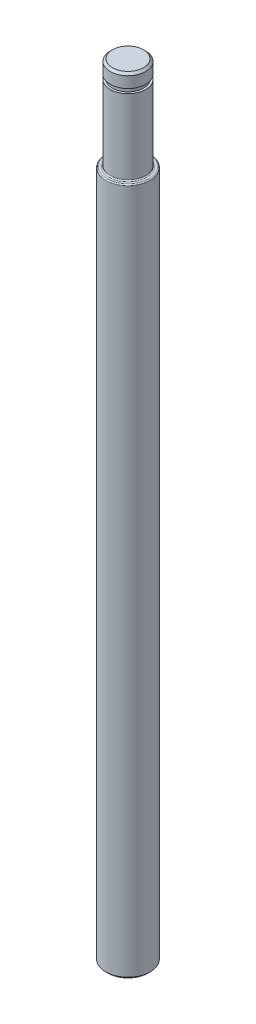
ISO-10303-21;
HEADER;
FILE_DESCRIPTION(('STEP AP214'),'2;1');
FILE_NAME('part.step','',(''),(''),'','','');
FILE_SCHEMA(('AUTOMOTIVE_DESIGN { 1 0 10303 214 1 1 1 1 }'));
ENDSEC;
DATA;
#1=APPLICATION_CONTEXT('core data for automotive mechanical design processes');
#2=APPLICATION_PROTOCOL_DEFINITION('international standard','automotive_design',2000,#1);
#3=PRODUCT_CONTEXT('',#1,'mechanical');
#4=PRODUCT('Part','Part','',(#3));
#5=PRODUCT_RELATED_PRODUCT_CATEGORY('part','',(#4));
#6=PRODUCT_DEFINITION_FORMATION('','',#4);
#7=PRODUCT_DEFINITION_CONTEXT('part definition',#1,'design');
#8=PRODUCT_DEFINITION('design','',#6,#7);
#9=PRODUCT_DEFINITION_SHAPE('','',#8);
#10=(LENGTH_UNIT() NAMED_UNIT(*) SI_UNIT(.MILLI.,.METRE.));
#11=(NAMED_UNIT(*) PLANE_ANGLE_UNIT() SI_UNIT($,.RADIAN.));
#12=(NAMED_UNIT(*) SI_UNIT($,.STERADIAN.) SOLID_ANGLE_UNIT());
#13=UNCERTAINTY_MEASURE_WITH_UNIT(LENGTH_MEASURE(1.E-05),#10,'distance_accuracy_value','');
#14=(GEOMETRIC_REPRESENTATION_CONTEXT(3) GLOBAL_UNCERTAINTY_ASSIGNED_CONTEXT((#13)) GLOBAL_UNIT_ASSIGNED_CONTEXT((#10,
#11,#12)) REPRESENTATION_CONTEXT('',''));
#15=CARTESIAN_POINT('',(0.,0.,0.));
#16=DIRECTION('',(0.,0.,1.));
#17=DIRECTION('',(1.,0.,0.));
#18=AXIS2_PLACEMENT_3D('',#15,#16,#17);
#19=CARTESIAN_POINT('',(0.,73.,0.));
#20=DIRECTION('',(0.,1.,0.));
#21=DIRECTION('',(0.,0.,1.));
#22=AXIS2_PLACEMENT_3D('',#19,#20,#21);
#23=CYLINDRICAL_SURFACE('',#22,4.);
#24=CARTESIAN_POINT('',(0.,73.25,0.));
#25=DIRECTION('',(0.,1.,0.));
#26=DIRECTION('',(0.,0.,1.));
#27=AXIS2_PLACEMENT_3D('',#24,#25,#26);
#28=CIRCLE('',#27,4.);
#29=CARTESIAN_POINT('',(0.,73.25,4.));
#30=VERTEX_POINT('',#29);
#31=EDGE_CURVE('E67',#30,#30,#28,.T.);
#32=CARTESIAN_POINT('',(0.,90.,0.));
#33=DIRECTION('',(0.,1.,0.));
#34=DIRECTION('',(0.,0.,1.));
#35=AXIS2_PLACEMENT_3D('',#32,#33,#34);
#36=CIRCLE('',#35,4.);
#37=CARTESIAN_POINT('',(0.,90.,4.));
#38=VERTEX_POINT('',#37);
#39=EDGE_CURVE('E35',#38,#38,#36,.F.);
#40=CARTESIAN_POINT('',(0.,73.25,4.));
#41=CARTESIAN_POINT('',(0.,73.4244791666667,4.));
#42=CARTESIAN_POINT('',(0.,73.5989583333333,4.));
#43=CARTESIAN_POINT('',(0.,73.9479166666667,4.));
#44=CARTESIAN_POINT('',(0.,74.1223958333333,4.));
#45=CARTESIAN_POINT('',(0.,74.4713541666667,4.));
#46=CARTESIAN_POINT('',(0.,74.6458333333333,4.));
#47=CARTESIAN_POINT('',(0.,74.9947916666667,4.));
#48=CARTESIAN_POINT('',(0.,75.1692708333333,4.));
#49=CARTESIAN_POINT('',(0.,75.5182291666667,4.));
#50=CARTESIAN_POINT('',(0.,75.6927083333333,4.));
#51=CARTESIAN_POINT('',(0.,76.0416666666667,4.));
#52=CARTESIAN_POINT('',(0.,76.2161458333333,4.));
#53=CARTESIAN_POINT('',(0.,76.5651041666667,4.));
#54=CARTESIAN_POINT('',(0.,76.7395833333333,4.));
#55=CARTESIAN_POINT('',(0.,77.0885416666667,4.));
#56=CARTESIAN_POINT('',(0.,77.2630208333333,4.));
#57=CARTESIAN_POINT('',(0.,77.6119791666667,4.));
#58=CARTESIAN_POINT('',(0.,77.7864583333333,4.));
#59=CARTESIAN_POINT('',(0.,78.1354166666667,4.));
#60=CARTESIAN_POINT('',(0.,78.3098958333333,4.));
#61=CARTESIAN_POINT('',(0.,78.6588541666667,4.));
#62=CARTESIAN_POINT('',(0.,78.8333333333333,4.));
#63=CARTESIAN_POINT('',(0.,79.1822916666667,4.));
#64=CARTESIAN_POINT('',(0.,79.3567708333333,4.));
#65=CARTESIAN_POINT('',(0.,79.7057291666667,4.));
#66=CARTESIAN_POINT('',(0.,79.8802083333333,4.));
#67=CARTESIAN_POINT('',(0.,80.2291666666667,4.));
#68=CARTESIAN_POINT('',(0.,80.4036458333333,4.));
#69=CARTESIAN_POINT('',(0.,80.7526041666667,4.));
#70=CARTESIAN_POINT('',(0.,80.9270833333333,4.));
#71=CARTESIAN_POINT('',(0.,81.2760416666667,4.));
#72=CARTESIAN_POINT('',(0.,81.4505208333333,4.));
#73=CARTESIAN_POINT('',(0.,81.7994791666667,4.));
#74=CARTESIAN_POINT('',(0.,81.9739583333333,4.));
#75=CARTESIAN_POINT('',(0.,82.3229166666667,4.));
#76=CARTESIAN_POINT('',(0.,82.4973958333333,4.));
#77=CARTESIAN_POINT('',(0.,82.8463541666667,4.));
#78=CARTESIAN_POINT('',(0.,83.0208333333333,4.));
#79=CARTESIAN_POINT('',(0.,83.3697916666667,4.));
#80=CARTESIAN_POINT('',(0.,83.5442708333333,4.));
#81=CARTESIAN_POINT('',(0.,83.8932291666667,4.));
#82=CARTESIAN_POINT('',(0.,84.0677083333333,4.));
#83=CARTESIAN_POINT('',(0.,84.4166666666667,4.));
#84=CARTESIAN_POINT('',(0.,84.5911458333333,4.));
#85=CARTESIAN_POINT('',(0.,84.9401041666667,4.));
#86=CARTESIAN_POINT('',(0.,85.1145833333333,4.));
#87=CARTESIAN_POINT('',(0.,85.4635416666667,4.));
#88=CARTESIAN_POINT('',(0.,85.6380208333333,4.));
#89=CARTESIAN_POINT('',(0.,85.9869791666667,4.));
#90=CARTESIAN_POINT('',(0.,86.1614583333333,4.));
#91=CARTESIAN_POINT('',(0.,86.5104166666667,4.));
#92=CARTESIAN_POINT('',(0.,86.6848958333333,4.));
#93=CARTESIAN_POINT('',(0.,87.0338541666667,4.));
#94=CARTESIAN_POINT('',(0.,87.2083333333333,4.));
#95=CARTESIAN_POINT('',(0.,87.5572916666667,4.));
#96=CARTESIAN_POINT('',(0.,87.7317708333333,4.));
#97=CARTESIAN_POINT('',(0.,88.0807291666667,4.));
#98=CARTESIAN_POINT('',(0.,88.2552083333333,4.));
#99=CARTESIAN_POINT('',(0.,88.6041666666667,4.));
#100=CARTESIAN_POINT('',(0.,88.7786458333333,4.));
#101=CARTESIAN_POINT('',(0.,89.1276041666667,4.));
#102=CARTESIAN_POINT('',(0.,89.3020833333333,4.));
#103=CARTESIAN_POINT('',(0.,89.6510416666667,4.));
#104=CARTESIAN_POINT('',(0.,89.8255208333333,4.));
#105=CARTESIAN_POINT('',(0.,90.,4.));
#106=B_SPLINE_CURVE_WITH_KNOTS('',3,(#40,#41,#42,#43,#44,#45,#46,#47,#48,#49,#50,#51,#52,#53,
#54,#55,#56,#57,#58,#59,#60,#61,#62,#63,#64,#65,#66,#67,#68,#69,#70,#71,#72,#73,#74,#75,#76,#77,
#78,#79,#80,#81,#82,#83,#84,#85,#86,#87,#88,#89,#90,#91,#92,#93,#94,#95,#96,#97,#98,#99,#100,
#101,#102,#103,#104,#105),.UNSPECIFIED.,.F.,.F.,(4,2,2,2,2,2,2,2,2,2,2,2,2,2,2,2,2,2,2,2,2,2,2,
2,2,2,2,2,2,2,2,2,4),(0.,0.523437499999987,1.04687499999999,1.57031249999999,2.09374999999999,
2.61718749999999,3.14062499999999,3.6640625,4.1875,4.7109375,5.234375,5.75781249999999,
6.28124999999999,6.80468749999999,7.32812499999999,7.85156249999999,8.37499999999999,
8.89843749999999,9.421875,9.9453125,10.46875,10.9921875,11.515625,12.0390625,12.5625,13.0859375,
13.609375,14.1328125,14.65625,15.1796875,15.703125,16.2265625,16.75),.UNSPECIFIED.);
#107=EDGE_CURVE('BSEAM31',#30,#38,#106,.T.);
#108=ORIENTED_EDGE('',*,*,#31,.T.);
#109=ORIENTED_EDGE('',*,*,#39,.T.);
#110=ORIENTED_EDGE('',*,*,#107,.T.);
#111=ORIENTED_EDGE('',*,*,#107,.F.);
#112=EDGE_LOOP('',(#108,#110,#109,#111));
#113=FACE_BOUND('',#112,.T.);
#114=ADVANCED_FACE('F31',(#113),#23,.T.);
#115=CARTESIAN_POINT('',(0.,-82.,0.));
#116=DIRECTION('',(0.,1.,0.));
#117=DIRECTION('',(0.,0.,1.));
#118=AXIS2_PLACEMENT_3D('',#115,#116,#117);
#119=CYLINDRICAL_SURFACE('',#118,5.);
#120=CARTESIAN_POINT('',(0.,-81.5,0.));
#121=DIRECTION('',(0.,1.,0.));
#122=DIRECTION('',(0.,0.,1.));
#123=AXIS2_PLACEMENT_3D('',#120,#121,#122);
#124=CIRCLE('',#123,5.);
#125=CARTESIAN_POINT('',(0.,-81.5,5.));
#126=VERTEX_POINT('',#125);
#127=EDGE_CURVE('E39',#126,#126,#124,.T.);
#128=ORIENTED_EDGE('',*,*,#127,.T.);
#129=EDGE_LOOP('',(#128));
#130=FACE_BOUND('',#129,.T.);
#131=CARTESIAN_POINT('',(0.,72.75,0.));
#132=DIRECTION('',(0.,1.,0.));
#133=DIRECTION('',(0.,0.,1.));
#134=AXIS2_PLACEMENT_3D('',#131,#132,#133);
#135=CIRCLE('',#134,5.);
#136=CARTESIAN_POINT('',(0.,72.75,5.));
#137=VERTEX_POINT('',#136);
#138=EDGE_CURVE('E44',#137,#137,#135,.F.);
#139=ORIENTED_EDGE('',*,*,#138,.T.);
#140=EDGE_LOOP('',(#139));
#141=FACE_BOUND('',#140,.T.);
#142=ADVANCED_FACE('F78',(#130,#141),#119,.T.);
#143=CARTESIAN_POINT('',(0.,-82.,0.));
#144=DIRECTION('',(0.,1.,0.));
#145=DIRECTION('',(0.,0.,1.));
#146=AXIS2_PLACEMENT_3D('',#143,#144,#145);
#147=PLANE('',#146);
#148=CARTESIAN_POINT('',(0.,-82.,0.));
#149=DIRECTION('',(0.,1.,0.));
#150=DIRECTION('',(0.,0.,1.));
#151=AXIS2_PLACEMENT_3D('',#148,#149,#150);
#152=CIRCLE('',#151,4.49999999999998);
#153=CARTESIAN_POINT('',(0.,-82.,4.49999999999998));
#154=VERTEX_POINT('',#153);
#155=EDGE_CURVE('E10',#154,#154,#152,.F.);
#156=ORIENTED_EDGE('',*,*,#155,.T.);
#157=EDGE_LOOP('',(#156));
#158=FACE_BOUND('',#157,.T.);
#159=ADVANCED_FACE('F101',(#158),#147,.F.);
#160=CARTESIAN_POINT('',(0.,73.,0.));
#161=DIRECTION('',(0.,1.,0.));
#162=DIRECTION('',(0.,0.,1.));
#163=AXIS2_PLACEMENT_3D('',#160,#161,#162);
#164=PLANE('',#163);
#165=CARTESIAN_POINT('',(0.,73.,0.));
#166=DIRECTION('',(0.,1.,0.));
#167=DIRECTION('',(0.,0.,1.));
#168=AXIS2_PLACEMENT_3D('',#165,#166,#167);
#169=CIRCLE('',#168,4.25);
#170=CARTESIAN_POINT('',(0.,73.,4.25));
#171=VERTEX_POINT('',#170);
#172=EDGE_CURVE('E73',#171,#171,#169,.F.);
#173=ORIENTED_EDGE('',*,*,#172,.T.);
#174=EDGE_LOOP('',(#173));
#175=FACE_BOUND('',#174,.T.);
#176=CARTESIAN_POINT('',(0.,73.,0.));
#177=DIRECTION('',(0.,1.,0.));
#178=DIRECTION('',(0.,0.,1.));
#179=AXIS2_PLACEMENT_3D('',#176,#177,#178);
#180=CIRCLE('',#179,4.75);
#181=CARTESIAN_POINT('',(0.,73.,4.75));
#182=VERTEX_POINT('',#181);
#183=EDGE_CURVE('E70',#182,#182,#180,.T.);
#184=ORIENTED_EDGE('',*,*,#183,.T.);
#185=EDGE_LOOP('',(#184));
#186=FACE_BOUND('',#185,.T.);
#187=ADVANCED_FACE('F90',(#175,#186),#164,.T.);
#188=CARTESIAN_POINT('',(0.,73.25,0.));
#189=DIRECTION('',(0.,1.,0.));
#190=DIRECTION('',(0.,0.,1.));
#191=AXIS2_PLACEMENT_3D('',#188,#189,#190);
#192=TOROIDAL_SURFACE('',#191,4.25,0.25);
#193=ORIENTED_EDGE('',*,*,#172,.F.);
#194=EDGE_LOOP('',(#193));
#195=FACE_BOUND('',#194,.T.);
#196=ORIENTED_EDGE('',*,*,#31,.F.);
#197=EDGE_LOOP('',(#196));
#198=FACE_BOUND('',#197,.T.);
#199=ADVANCED_FACE('F82',(#195,#198),#192,.F.);
#200=CARTESIAN_POINT('',(0.,72.75,0.));
#201=DIRECTION('',(0.,1.,0.));
#202=DIRECTION('',(0.,0.,1.));
#203=AXIS2_PLACEMENT_3D('',#200,#201,#202);
#204=TOROIDAL_SURFACE('',#203,4.75,0.25);
#205=ORIENTED_EDGE('',*,*,#183,.F.);
#206=EDGE_LOOP('',(#205));
#207=FACE_BOUND('',#206,.T.);
#208=ORIENTED_EDGE('',*,*,#138,.F.);
#209=EDGE_LOOP('',(#208));
#210=FACE_BOUND('',#209,.T.);
#211=ADVANCED_FACE('F80',(#207,#210),#204,.T.);
#212=CARTESIAN_POINT('',(0.,-81.5,0.));
#213=DIRECTION('',(0.,1.,0.));
#214=DIRECTION('',(0.,0.,1.));
#215=AXIS2_PLACEMENT_3D('',#212,#213,#214);
#216=CONICAL_SURFACE('',#215,5.,0.785398163397459);
#217=ORIENTED_EDGE('',*,*,#155,.F.);
#218=EDGE_LOOP('',(#217));
#219=FACE_BOUND('',#218,.T.);
#220=ORIENTED_EDGE('',*,*,#127,.F.);
#221=EDGE_LOOP('',(#220));
#222=FACE_BOUND('',#221,.T.);
#223=ADVANCED_FACE('F33',(#219,#222),#216,.T.);
#224=CARTESIAN_POINT('',(0.,90.,0.));
#225=DIRECTION('',(0.,1.,0.));
#226=DIRECTION('',(0.,0.,1.));
#227=AXIS2_PLACEMENT_3D('',#224,#225,#226);
#228=PLANE('',#227);
#229=ORIENTED_EDGE('',*,*,#39,.F.);
#230=EDGE_LOOP('',(#229));
#231=FACE_BOUND('',#230,.T.);
#232=CARTESIAN_POINT('',(0.,90.,0.));
#233=DIRECTION('',(0.,1.,0.));
#234=DIRECTION('',(0.,0.,1.));
#235=AXIS2_PLACEMENT_3D('',#232,#233,#234);
#236=CIRCLE('',#235,3.49999999999998);
#237=CARTESIAN_POINT('',(0.,90.,3.49999999999998));
#238=VERTEX_POINT('',#237);
#239=EDGE_CURVE('E49',#238,#238,#236,.T.);
#240=ORIENTED_EDGE('',*,*,#239,.F.);
#241=EDGE_LOOP('',(#240));
#242=FACE_BOUND('',#241,.T.);
#243=ADVANCED_FACE('F88',(#231,#242),#228,.T.);
#244=CARTESIAN_POINT('',(0.,91.,0.));
#245=DIRECTION('',(0.,1.,0.));
#246=DIRECTION('',(0.,0.,1.));
#247=AXIS2_PLACEMENT_3D('',#244,#245,#246);
#248=PLANE('',#247);
#249=CARTESIAN_POINT('',(0.,91.,0.));
#250=DIRECTION('',(0.,1.,0.));
#251=DIRECTION('',(0.,0.,1.));
#252=AXIS2_PLACEMENT_3D('',#249,#250,#251);
#253=CIRCLE('',#252,4.);
#254=CARTESIAN_POINT('',(0.,91.,4.));
#255=VERTEX_POINT('',#254);
#256=EDGE_CURVE('E47',#255,#255,#253,.F.);
#257=ORIENTED_EDGE('',*,*,#256,.T.);
#258=EDGE_LOOP('',(#257));
#259=FACE_BOUND('',#258,.T.);
#260=CARTESIAN_POINT('',(0.,91.,0.));
#261=DIRECTION('',(0.,1.,0.));
#262=DIRECTION('',(0.,0.,1.));
#263=AXIS2_PLACEMENT_3D('',#260,#261,#262);
#264=CIRCLE('',#263,3.49999999999998);
#265=CARTESIAN_POINT('',(0.,91.,3.49999999999998));
#266=VERTEX_POINT('',#265);
#267=EDGE_CURVE('E55',#266,#266,#264,.T.);
#268=ORIENTED_EDGE('',*,*,#267,.T.);
#269=EDGE_LOOP('',(#268));
#270=FACE_BOUND('',#269,.T.);
#271=ADVANCED_FACE('F127',(#259,#270),#248,.F.);
#272=CARTESIAN_POINT('',(0.,90.,0.));
#273=DIRECTION('',(0.,1.,0.));
#274=DIRECTION('',(0.,0.,1.));
#275=AXIS2_PLACEMENT_3D('',#272,#273,#274);
#276=CYLINDRICAL_SURFACE('',#275,3.49999999999998);
#277=ORIENTED_EDGE('',*,*,#239,.T.);
#278=EDGE_LOOP('',(#277));
#279=FACE_BOUND('',#278,.T.);
#280=ORIENTED_EDGE('',*,*,#267,.F.);
#281=EDGE_LOOP('',(#280));
#282=FACE_BOUND('',#281,.T.);
#283=ADVANCED_FACE('F122',(#279,#282),#276,.T.);
#284=CARTESIAN_POINT('',(0.,94.,0.));
#285=DIRECTION('',(0.,1.,0.));
#286=DIRECTION('',(0.,0.,1.));
#287=AXIS2_PLACEMENT_3D('',#284,#285,#286);
#288=PLANE('',#287);
#289=CARTESIAN_POINT('',(0.,94.,0.));
#290=DIRECTION('',(0.,1.,0.));
#291=DIRECTION('',(0.,0.,1.));
#292=AXIS2_PLACEMENT_3D('',#289,#290,#291);
#293=CIRCLE('',#292,3.50000000000011);
#294=CARTESIAN_POINT('',(0.,94.,3.50000000000011));
#295=VERTEX_POINT('',#294);
#296=EDGE_CURVE('E53',#295,#295,#293,.T.);
#297=ORIENTED_EDGE('',*,*,#296,.T.);
#298=EDGE_LOOP('',(#297));
#299=FACE_BOUND('',#298,.T.);
#300=ADVANCED_FACE('F113',(#299),#288,.T.);
#301=CARTESIAN_POINT('',(0.,94.,0.));
#302=DIRECTION('',(0.,-1.,0.));
#303=DIRECTION('',(0.,0.,-1.));
#304=AXIS2_PLACEMENT_3D('',#301,#302,#303);
#305=CONICAL_SURFACE('',#304,3.50000000000011,0.785398163397432);
#306=CARTESIAN_POINT('',(0.,93.5000000000001,0.));
#307=DIRECTION('',(0.,1.,0.));
#308=DIRECTION('',(0.,0.,1.));
#309=AXIS2_PLACEMENT_3D('',#306,#307,#308);
#310=CIRCLE('',#309,4.);
#311=CARTESIAN_POINT('',(0.,93.5000000000001,4.));
#312=VERTEX_POINT('',#311);
#313=EDGE_CURVE('E64',#312,#312,#310,.F.);
#314=ORIENTED_EDGE('',*,*,#313,.F.);
#315=EDGE_LOOP('',(#314));
#316=FACE_BOUND('',#315,.T.);
#317=ORIENTED_EDGE('',*,*,#296,.F.);
#318=EDGE_LOOP('',(#317));
#319=FACE_BOUND('',#318,.T.);
#320=ADVANCED_FACE('F108',(#316,#319),#305,.T.);
#321=CARTESIAN_POINT('',(0.,91.,4.));
#322=CARTESIAN_POINT('',(0.,91.0260416666667,4.));
#323=CARTESIAN_POINT('',(0.,91.0520833333333,4.));
#324=CARTESIAN_POINT('',(0.,91.1041666666667,4.));
#325=CARTESIAN_POINT('',(0.,91.1302083333333,4.));
#326=CARTESIAN_POINT('',(0.,91.1822916666667,4.));
#327=CARTESIAN_POINT('',(0.,91.2083333333333,4.));
#328=CARTESIAN_POINT('',(0.,91.2604166666667,4.));
#329=CARTESIAN_POINT('',(0.,91.2864583333333,4.));
#330=CARTESIAN_POINT('',(0.,91.3385416666667,4.));
#331=CARTESIAN_POINT('',(0.,91.3645833333333,4.));
#332=CARTESIAN_POINT('',(0.,91.4166666666667,4.));
#333=CARTESIAN_POINT('',(0.,91.4427083333333,4.));
#334=CARTESIAN_POINT('',(0.,91.4947916666667,4.));
#335=CARTESIAN_POINT('',(0.,91.5208333333333,4.));
#336=CARTESIAN_POINT('',(0.,91.5729166666667,4.));
#337=CARTESIAN_POINT('',(0.,91.5989583333333,4.));
#338=CARTESIAN_POINT('',(0.,91.6510416666667,4.));
#339=CARTESIAN_POINT('',(0.,91.6770833333334,4.));
#340=CARTESIAN_POINT('',(0.,91.7291666666667,4.));
#341=CARTESIAN_POINT('',(0.,91.7552083333334,4.));
#342=CARTESIAN_POINT('',(0.,91.8072916666667,4.));
#343=CARTESIAN_POINT('',(0.,91.8333333333334,4.));
#344=CARTESIAN_POINT('',(0.,91.8854166666667,4.));
#345=CARTESIAN_POINT('',(0.,91.9114583333334,4.));
#346=CARTESIAN_POINT('',(0.,91.9635416666667,4.));
#347=CARTESIAN_POINT('',(0.,91.9895833333334,4.));
#348=CARTESIAN_POINT('',(0.,92.0416666666667,4.));
#349=CARTESIAN_POINT('',(0.,92.0677083333334,4.));
#350=CARTESIAN_POINT('',(0.,92.1197916666667,4.));
#351=CARTESIAN_POINT('',(0.,92.1458333333334,4.));
#352=CARTESIAN_POINT('',(0.,92.1979166666667,4.));
#353=CARTESIAN_POINT('',(0.,92.2239583333334,4.));
#354=CARTESIAN_POINT('',(0.,92.2760416666667,4.));
#355=CARTESIAN_POINT('',(0.,92.3020833333334,4.));
#356=CARTESIAN_POINT('',(0.,92.3541666666667,4.));
#357=CARTESIAN_POINT('',(0.,92.3802083333334,4.));
#358=CARTESIAN_POINT('',(0.,92.4322916666667,4.));
#359=CARTESIAN_POINT('',(0.,92.4583333333334,4.));
#360=CARTESIAN_POINT('',(0.,92.5104166666667,4.));
#361=CARTESIAN_POINT('',(0.,92.5364583333334,4.));
#362=CARTESIAN_POINT('',(0.,92.5885416666667,4.));
#363=CARTESIAN_POINT('',(0.,92.6145833333334,4.));
#364=CARTESIAN_POINT('',(0.,92.6666666666667,4.));
#365=CARTESIAN_POINT('',(0.,92.6927083333334,4.));
#366=CARTESIAN_POINT('',(0.,92.7447916666667,4.));
#367=CARTESIAN_POINT('',(0.,92.7708333333334,4.));
#368=CARTESIAN_POINT('',(0.,92.8229166666667,4.));
#369=CARTESIAN_POINT('',(0.,92.8489583333334,4.));
#370=CARTESIAN_POINT('',(0.,92.9010416666667,4.));
#371=CARTESIAN_POINT('',(0.,92.9270833333334,4.));
#372=CARTESIAN_POINT('',(0.,92.9791666666667,4.));
#373=CARTESIAN_POINT('',(0.,93.0052083333334,4.));
#374=CARTESIAN_POINT('',(0.,93.0572916666667,4.));
#375=CARTESIAN_POINT('',(0.,93.0833333333334,4.));
#376=CARTESIAN_POINT('',(0.,93.1354166666667,4.));
#377=CARTESIAN_POINT('',(0.,93.1614583333334,4.));
#378=CARTESIAN_POINT('',(0.,93.2135416666667,4.));
#379=CARTESIAN_POINT('',(0.,93.2395833333334,4.));
#380=CARTESIAN_POINT('',(0.,93.2916666666668,4.));
#381=CARTESIAN_POINT('',(0.,93.3177083333334,4.));
#382=CARTESIAN_POINT('',(0.,93.3697916666668,4.));
#383=CARTESIAN_POINT('',(0.,93.3958333333334,4.));
#384=CARTESIAN_POINT('',(0.,93.4479166666668,4.));
#385=CARTESIAN_POINT('',(0.,93.4739583333334,4.));
#386=CARTESIAN_POINT('',(0.,93.5000000000001,4.));
#387=B_SPLINE_CURVE_WITH_KNOTS('',3,(#321,#322,#323,#324,#325,#326,#327,#328,#329,#330,#331,
#332,#333,#334,#335,#336,#337,#338,#339,#340,#341,#342,#343,#344,#345,#346,#347,#348,#349,#350,
#351,#352,#353,#354,#355,#356,#357,#358,#359,#360,#361,#362,#363,#364,#365,#366,#367,#368,#369,
#370,#371,#372,#373,#374,#375,#376,#377,#378,#379,#380,#381,#382,#383,#384,#385,#386),
.UNSPECIFIED.,.F.,.F.,(4,2,2,2,2,2,2,2,2,2,2,2,2,2,2,2,2,2,2,2,2,2,2,2,2,2,2,2,2,2,2,2,4),(0.,
0.0781249999999983,0.156250000000011,0.234375000000009,0.312500000000021,0.390625000000019,
0.468750000000032,0.54687500000003,0.625000000000028,0.703125000000041,0.781250000000039,
0.859375000000037,0.937500000000049,1.01562500000005,1.09375000000005,1.17187500000006,
1.25000000000006,1.32812500000006,1.40625000000007,1.48437500000007,1.56250000000006,
1.64062500000008,1.71875000000007,1.79687500000007,1.87500000000008,1.95312500000008,
2.03125000000008,2.10937500000009,2.18750000000009,2.2656250000001,2.3437500000001,
2.4218750000001,2.50000000000011),.UNSPECIFIED.);
#388=EDGE_CURVE('BSEAM97',#255,#312,#387,.T.);
#389=ORIENTED_EDGE('',*,*,#256,.F.);
#390=ORIENTED_EDGE('',*,*,#313,.T.);
#391=ORIENTED_EDGE('',*,*,#388,.T.);
#392=ORIENTED_EDGE('',*,*,#388,.F.);
#393=EDGE_LOOP('',(#389,#391,#390,#392));
#394=FACE_BOUND('',#393,.T.);
#395=ADVANCED_FACE('F97',(#394),#23,.T.);
#396=CLOSED_SHELL('',(#114,#142,#159,#187,#199,#211,#223,#243,#271,#283,#300,#320,#395));
#397=MANIFOLD_SOLID_BREP('B2',#396);
#398=ADVANCED_BREP_SHAPE_REPRESENTATION('',(#18,#397),#14);
#399=SHAPE_DEFINITION_REPRESENTATION(#9,#398);
ENDSEC;
END-ISO-10303-21;
